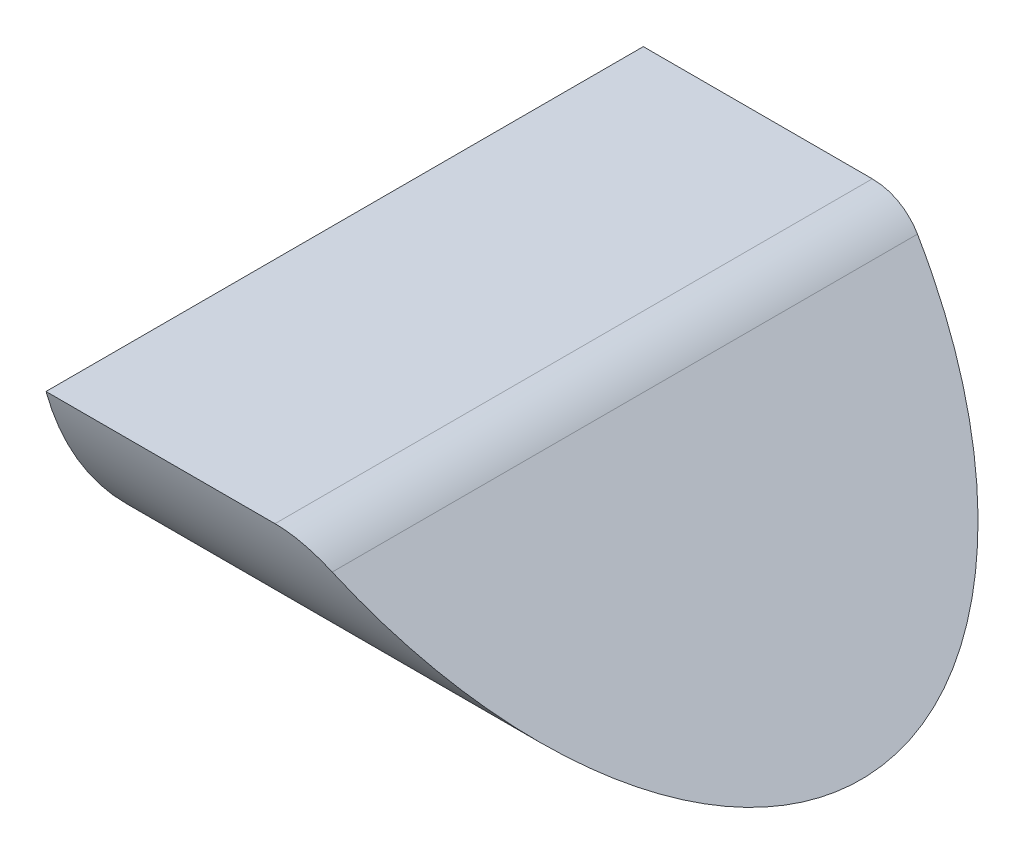
ISO-10303-21;
HEADER;
FILE_DESCRIPTION(('STEP AP214'),'2;1');
FILE_NAME('part.step','',(''),(''),'','','');
FILE_SCHEMA(('AUTOMOTIVE_DESIGN { 1 0 10303 214 1 1 1 1 }'));
ENDSEC;
DATA;
#1=APPLICATION_CONTEXT('core data for automotive mechanical design processes');
#2=APPLICATION_PROTOCOL_DEFINITION('international standard','automotive_design',2000,#1);
#3=PRODUCT_CONTEXT('',#1,'mechanical');
#4=PRODUCT('Part','Part','',(#3));
#5=PRODUCT_RELATED_PRODUCT_CATEGORY('part','',(#4));
#6=PRODUCT_DEFINITION_FORMATION('','',#4);
#7=PRODUCT_DEFINITION_CONTEXT('part definition',#1,'design');
#8=PRODUCT_DEFINITION('design','',#6,#7);
#9=PRODUCT_DEFINITION_SHAPE('','',#8);
#10=(LENGTH_UNIT() NAMED_UNIT(*) SI_UNIT(.MILLI.,.METRE.));
#11=(NAMED_UNIT(*) PLANE_ANGLE_UNIT() SI_UNIT($,.RADIAN.));
#12=(NAMED_UNIT(*) SI_UNIT($,.STERADIAN.) SOLID_ANGLE_UNIT());
#13=UNCERTAINTY_MEASURE_WITH_UNIT(LENGTH_MEASURE(1.E-05),#10,'distance_accuracy_value','');
#14=(GEOMETRIC_REPRESENTATION_CONTEXT(3) GLOBAL_UNCERTAINTY_ASSIGNED_CONTEXT((#13)) GLOBAL_UNIT_ASSIGNED_CONTEXT((#10,
#11,#12)) REPRESENTATION_CONTEXT('',''));
#15=CARTESIAN_POINT('',(0.,0.,0.));
#16=DIRECTION('',(0.,0.,1.));
#17=DIRECTION('',(1.,0.,0.));
#18=AXIS2_PLACEMENT_3D('',#15,#16,#17);
#19=CARTESIAN_POINT('',(0.,0.,0.));
#20=DIRECTION('',(1.,0.,0.));
#21=DIRECTION('',(0.,0.,-1.));
#22=AXIS2_PLACEMENT_3D('',#19,#20,#21);
#23=PLANE('',#22);
#24=CARTESIAN_POINT('',(0.,-45.72,0.));
#25=DIRECTION('',(-1.,0.,0.));
#26=DIRECTION('',(0.,0.,1.));
#27=AXIS2_PLACEMENT_3D('',#24,#25,#26);
#28=CIRCLE('',#27,6.477);
#29=CARTESIAN_POINT('',(0.,-45.72,6.477));
#30=VERTEX_POINT('',#29);
#31=EDGE_CURVE('E95',#30,#30,#28,.T.);
#32=ORIENTED_EDGE('',*,*,#31,.F.);
#33=EDGE_LOOP('',(#32));
#34=FACE_BOUND('',#33,.T.);
#35=DIRECTION('',(0.,0.,1.));
#36=VECTOR('',#35,1.);
#37=CARTESIAN_POINT('',(0.,-20.32,73.4407080575889));
#38=LINE('',#37,#36);
#39=CARTESIAN_POINT('',(0.,-20.32,-73.4407080575889));
#40=VERTEX_POINT('',#39);
#41=CARTESIAN_POINT('',(0.,-20.32,73.4407080575889));
#42=VERTEX_POINT('',#41);
#43=EDGE_CURVE('E49',#40,#42,#38,.T.);
#44=ORIENTED_EDGE('',*,*,#43,.F.);
#45=CARTESIAN_POINT('',(0.,0.,0.));
#46=DIRECTION('',(1.,0.,0.));
#47=DIRECTION('',(0.,0.,-1.));
#48=AXIS2_PLACEMENT_3D('',#45,#46,#47);
#49=CIRCLE('',#48,76.2);
#50=EDGE_CURVE('E11',#42,#40,#49,.T.);
#51=ORIENTED_EDGE('',*,*,#50,.F.);
#52=EDGE_LOOP('',(#44,#51));
#53=FACE_BOUND('',#52,.T.);
#54=ADVANCED_FACE('F42',(#34,#53),#23,.F.);
#55=CARTESIAN_POINT('',(127.,-76.2,-73.4407080575889));
#56=DIRECTION('',(0.660627894892025,0.750713516922755,0.));
#57=DIRECTION('',(-0.750713516922755,0.660627894892025,0.));
#58=AXIS2_PLACEMENT_3D('',#55,#56,#57);
#59=PLANE('',#58);
#60=CARTESIAN_POINT('',(40.4090909090909,0.,0.));
#61=DIRECTION('',(0.660627894892025,0.750713516922755,0.));
#62=DIRECTION('',(-0.750713516922755,0.660627894892025,0.));
#63=AXIS2_PLACEMENT_3D('',#60,#61,#62);
#64=ELLIPSE('',#63,115.344811487947,76.2);
#65=CARTESIAN_POINT('',(68.8964857984335,-25.0689075026215,71.9582509280555));
#66=VERTEX_POINT('',#65);
#67=CARTESIAN_POINT('',(68.8964857984335,-25.0689075026215,-71.9582509280555));
#68=VERTEX_POINT('',#67);
#69=EDGE_CURVE('E86',#66,#68,#64,.T.);
#70=ORIENTED_EDGE('',*,*,#69,.T.);
#71=DIRECTION('',(0.,0.,1.));
#72=VECTOR('',#71,1.);
#73=CARTESIAN_POINT('',(68.8964857984335,-25.0689075026215,73.4407080575889));
#74=LINE('',#73,#72);
#75=EDGE_CURVE('E77',#68,#66,#74,.T.);
#76=ORIENTED_EDGE('',*,*,#75,.T.);
#77=EDGE_LOOP('',(#70,#76));
#78=FACE_BOUND('',#77,.T.);
#79=ADVANCED_FACE('F85',(#78),#59,.T.);
#80=CARTESIAN_POINT('',(56.3115244007405,-39.37,-73.4407080575889));
#81=DIRECTION('',(0.,0.,-1.));
#82=DIRECTION('',(-1.,0.,0.));
#83=AXIS2_PLACEMENT_3D('',#80,#81,#82);
#84=CYLINDRICAL_SURFACE('',#83,19.05);
#85=CARTESIAN_POINT('',(56.3115244007405,-20.32,-73.4407080575889));
#86=CARTESIAN_POINT('',(56.5700300316652,-20.3199991554033,-73.4407063359609));
#87=CARTESIAN_POINT('',(56.8285068692522,-20.3252625194358,-73.4392522302459));
#88=CARTESIAN_POINT('',(57.3449933709856,-20.3462977918162,-73.4334279449559));
#89=CARTESIAN_POINT('',(57.6030030463425,-20.3620694445554,-73.4290578363111));
#90=CARTESIAN_POINT('',(58.3756196292876,-20.4251079297358,-73.4115590749349));
#91=CARTESIAN_POINT('',(58.8889310985459,-20.4880983076445,-73.3940419959211));
#92=CARTESIAN_POINT('',(59.9085459181511,-20.6555396830979,-73.3470942027149));
#93=CARTESIAN_POINT('',(60.4148443763769,-20.7600182495076,-73.3176555664));
#94=CARTESIAN_POINT('',(61.1659162184489,-20.9470794237377,-73.2643432188116));
#95=CARTESIAN_POINT('',(61.4148825050259,-21.0144920494826,-73.2450462183593));
#96=CARTESIAN_POINT('',(61.9096992011996,-21.1593050646107,-73.2033434518041));
#97=CARTESIAN_POINT('',(62.1555487973612,-21.2367080047689,-73.180936891643));
#98=CARTESIAN_POINT('',(62.8879148651462,-21.4837192599353,-73.1089553677631));
#99=CARTESIAN_POINT('',(63.3690781785711,-21.6680874998351,-73.0546305428251));
#100=CARTESIAN_POINT('',(64.3135040794081,-22.0744775645498,-72.9328620778276));
#101=CARTESIAN_POINT('',(64.776766727245,-22.2964992622499,-72.8654184820558));
#102=CARTESIAN_POINT('',(65.4553064640745,-22.655959058814,-72.7541282211962));
#103=CARTESIAN_POINT('',(65.6785787479972,-22.7800674413941,-72.7153810237203));
#104=CARTESIAN_POINT('',(66.1194358324064,-23.0368299196799,-72.6344449693006));
#105=CARTESIAN_POINT('',(66.3370219237689,-23.1694820516768,-72.5922569026222));
#106=CARTESIAN_POINT('',(66.9806094084258,-23.5797588645024,-72.4604543853985));
#107=CARTESIAN_POINT('',(67.3977311739668,-23.869858442782,-72.3655541843622));
#108=CARTESIAN_POINT('',(67.9900014033369,-24.317701229711,-72.2157325643111));
#109=CARTESIAN_POINT('',(68.1756868803434,-24.4636329764668,-72.1664429477341));
#110=CARTESIAN_POINT('',(68.5407785815588,-24.7616711283959,-72.0647237133339));
#111=CARTESIAN_POINT('',(68.7201917406196,-24.9137702849992,-72.012297749068));
#112=CARTESIAN_POINT('',(68.8964857984335,-25.0689075026215,-71.9582509280555));
#113=B_SPLINE_CURVE_WITH_KNOTS('',3,(#85,#86,#87,#88,#89,#90,#91,#92,#93,#94,#95,#96,#97,#98,
#99,#100,#101,#102,#103,#104,#105,#106,#107,#108,#109,#110,#111,#112),.UNSPECIFIED.,.F.,.F.,(4,
2,2,2,2,2,2,2,2,2,2,2,2,4),(0.,0.775401755467531,1.55078465037207,3.10120056928607,
4.65264846686549,5.42840398235091,6.20435796075182,7.75679239890763,9.30922159628545,
10.0841266728021,10.8588542751337,12.4073134809147,13.1309404636671,13.8537403093022),.UNSPECIFIED.);
#114=CARTESIAN_POINT('',(56.3115244007405,-20.32,-73.4407080575889));
#115=VERTEX_POINT('',#114);
#116=EDGE_CURVE('E81',#115,#68,#113,.T.);
#117=ORIENTED_EDGE('',*,*,#116,.F.);
#118=DIRECTION('',(0.,0.,1.));
#119=VECTOR('',#118,1.);
#120=CARTESIAN_POINT('',(56.3115244007405,-20.32,-73.4407080575889));
#121=LINE('',#120,#119);
#122=CARTESIAN_POINT('',(56.3115244007405,-20.32,73.4407080575889));
#123=VERTEX_POINT('',#122);
#124=EDGE_CURVE('E78',#123,#115,#121,.F.);
#125=ORIENTED_EDGE('',*,*,#124,.F.);
#126=CARTESIAN_POINT('',(68.8964857984335,-25.0689075026215,71.9582509280555));
#127=CARTESIAN_POINT('',(68.7064542501679,-24.9016785081498,72.0165103712882));
#128=CARTESIAN_POINT('',(68.5127854519955,-24.7379734106293,72.0728884396596));
#129=CARTESIAN_POINT('',(68.118430385301,-24.417944457579,72.1819407291992));
#130=CARTESIAN_POINT('',(67.9177440441064,-24.2616206785282,72.2346149119936));
#131=CARTESIAN_POINT('',(67.305615092634,-23.8042750176876,72.3871520859349));
#132=CARTESIAN_POINT('',(66.8840420341254,-23.5148254865147,72.4815481690505));
#133=CARTESIAN_POINT('',(66.0162823982986,-22.969289875495,72.6562726062024));
#134=CARTESIAN_POINT('',(65.5700619251986,-22.7132514556661,72.7365809194179));
#135=CARTESIAN_POINT('',(64.6565907722593,-22.2373547959698,72.8834829377334));
#136=CARTESIAN_POINT('',(64.1893418060932,-22.0174936146887,72.9500777579287));
#137=CARTESIAN_POINT('',(63.2366164349324,-21.6157567148279,73.0701244943568));
#138=CARTESIAN_POINT('',(62.751122593231,-21.4339184832271,73.1235634492858));
#139=CARTESIAN_POINT('',(61.7657137088763,-21.1101173924322,73.2176987135927));
#140=CARTESIAN_POINT('',(61.2657962544859,-20.9681612449332,73.2583928783014));
#141=CARTESIAN_POINT('',(60.2564618946426,-20.7257313441812,73.3273476315661));
#142=CARTESIAN_POINT('',(59.7470707423129,-20.6251585940407,73.3556379033363));
#143=CARTESIAN_POINT('',(58.7214840405937,-20.4659362421299,73.4002203277552));
#144=CARTESIAN_POINT('',(58.2052925881303,-20.4072624774118,73.4165193958391));
#145=CARTESIAN_POINT('',(57.4585424680954,-20.3531744547465,73.4315226030949));
#146=CARTESIAN_POINT('',(57.2291968767097,-20.3407293276696,73.4349700272801));
#147=CARTESIAN_POINT('',(56.7704180495646,-20.3241466960878,73.4395609779635));
#148=CARTESIAN_POINT('',(56.5409851449127,-20.3200006846576,73.4407068636348));
#149=CARTESIAN_POINT('',(56.3115244007405,-20.32,73.4407080575889));
#150=B_SPLINE_CURVE_WITH_KNOTS('',3,(#126,#127,#128,#129,#130,#131,#132,#133,#134,#135,#136,
#137,#138,#139,#140,#141,#142,#143,#144,#145,#146,#147,#148,#149),.UNSPECIFIED.,.F.,.F.,(4,2,2,
2,2,2,2,2,2,2,2,4),(0.,0.779143026024567,1.55829412311673,3.116348855589,4.67660236416525,
6.2367289525701,7.79838649844045,9.36030669607524,10.9184684540224,12.475730900133,
13.1647238035012,13.853010099203),.UNSPECIFIED.);
#151=EDGE_CURVE('E73',#66,#123,#150,.T.);
#152=ORIENTED_EDGE('',*,*,#151,.F.);
#153=ORIENTED_EDGE('',*,*,#75,.F.);
#154=EDGE_LOOP('',(#117,#125,#152,#153));
#155=FACE_BOUND('',#154,.T.);
#156=ADVANCED_FACE('F76',(#155),#84,.T.);
#157=CARTESIAN_POINT('',(127.,0.,0.));
#158=DIRECTION('',(-1.,0.,0.));
#159=DIRECTION('',(0.,0.,1.));
#160=AXIS2_PLACEMENT_3D('',#157,#158,#159);
#161=CYLINDRICAL_SURFACE('',#160,76.2);
#162=DIRECTION('',(-1.,0.,0.));
#163=VECTOR('',#162,1.);
#164=CARTESIAN_POINT('',(127.,-20.32,73.4407080575889));
#165=LINE('',#164,#163);
#166=EDGE_CURVE('E90',#123,#42,#165,.T.);
#167=ORIENTED_EDGE('',*,*,#166,.T.);
#168=ORIENTED_EDGE('',*,*,#50,.T.);
#169=DIRECTION('',(-1.,0.,0.));
#170=VECTOR('',#169,1.);
#171=CARTESIAN_POINT('',(127.,-20.32,-73.4407080575889));
#172=LINE('',#171,#170);
#173=EDGE_CURVE('E87',#115,#40,#172,.T.);
#174=ORIENTED_EDGE('',*,*,#173,.F.);
#175=ORIENTED_EDGE('',*,*,#116,.T.);
#176=ORIENTED_EDGE('',*,*,#69,.F.);
#177=ORIENTED_EDGE('',*,*,#151,.T.);
#178=EDGE_LOOP('',(#167,#168,#174,#175,#176,#177));
#179=FACE_BOUND('',#178,.T.);
#180=ADVANCED_FACE('F89',(#179),#161,.T.);
#181=CARTESIAN_POINT('',(127.,-20.32,73.4407080575889));
#182=DIRECTION('',(0.,-1.,0.));
#183=DIRECTION('',(0.,0.,-1.));
#184=AXIS2_PLACEMENT_3D('',#181,#182,#183);
#185=PLANE('',#184);
#186=ORIENTED_EDGE('',*,*,#173,.T.);
#187=ORIENTED_EDGE('',*,*,#43,.T.);
#188=ORIENTED_EDGE('',*,*,#166,.F.);
#189=ORIENTED_EDGE('',*,*,#124,.T.);
#190=EDGE_LOOP('',(#186,#187,#188,#189));
#191=FACE_BOUND('',#190,.T.);
#192=ADVANCED_FACE('F115',(#191),#185,.F.);
#193=CARTESIAN_POINT('',(7.62,-45.72,0.));
#194=DIRECTION('',(-1.,0.,0.));
#195=DIRECTION('',(0.,0.,1.));
#196=AXIS2_PLACEMENT_3D('',#193,#194,#195);
#197=CYLINDRICAL_SURFACE('',#196,6.477);
#198=CARTESIAN_POINT('',(7.62,-45.72,0.));
#199=DIRECTION('',(-1.,0.,0.));
#200=DIRECTION('',(0.,0.,1.));
#201=AXIS2_PLACEMENT_3D('',#198,#199,#200);
#202=CIRCLE('',#201,6.477);
#203=CARTESIAN_POINT('',(7.62,-45.72,6.477));
#204=VERTEX_POINT('',#203);
#205=EDGE_CURVE('E91',#204,#204,#202,.T.);
#206=CARTESIAN_POINT('',(7.62,-45.72,6.477));
#207=CARTESIAN_POINT('',(7.540625,-45.72,6.477));
#208=CARTESIAN_POINT('',(7.46125,-45.72,6.477));
#209=CARTESIAN_POINT('',(7.3025,-45.72,6.477));
#210=CARTESIAN_POINT('',(7.223125,-45.72,6.477));
#211=CARTESIAN_POINT('',(7.064375,-45.72,6.477));
#212=CARTESIAN_POINT('',(6.985,-45.72,6.477));
#213=CARTESIAN_POINT('',(6.82625,-45.72,6.477));
#214=CARTESIAN_POINT('',(6.746875,-45.72,6.477));
#215=CARTESIAN_POINT('',(6.588125,-45.72,6.477));
#216=CARTESIAN_POINT('',(6.50875,-45.72,6.477));
#217=CARTESIAN_POINT('',(6.35,-45.72,6.477));
#218=CARTESIAN_POINT('',(6.270625,-45.72,6.477));
#219=CARTESIAN_POINT('',(6.111875,-45.72,6.477));
#220=CARTESIAN_POINT('',(6.0325,-45.72,6.477));
#221=CARTESIAN_POINT('',(5.87375,-45.72,6.477));
#222=CARTESIAN_POINT('',(5.794375,-45.72,6.477));
#223=CARTESIAN_POINT('',(5.635625,-45.72,6.477));
#224=CARTESIAN_POINT('',(5.55625,-45.72,6.477));
#225=CARTESIAN_POINT('',(5.3975,-45.72,6.477));
#226=CARTESIAN_POINT('',(5.318125,-45.72,6.477));
#227=CARTESIAN_POINT('',(5.159375,-45.72,6.477));
#228=CARTESIAN_POINT('',(5.08,-45.72,6.477));
#229=CARTESIAN_POINT('',(4.92125,-45.72,6.477));
#230=CARTESIAN_POINT('',(4.841875,-45.72,6.477));
#231=CARTESIAN_POINT('',(4.683125,-45.72,6.477));
#232=CARTESIAN_POINT('',(4.60375,-45.72,6.477));
#233=CARTESIAN_POINT('',(4.445,-45.72,6.477));
#234=CARTESIAN_POINT('',(4.365625,-45.72,6.477));
#235=CARTESIAN_POINT('',(4.206875,-45.72,6.477));
#236=CARTESIAN_POINT('',(4.1275,-45.72,6.477));
#237=CARTESIAN_POINT('',(3.96875,-45.72,6.477));
#238=CARTESIAN_POINT('',(3.889375,-45.72,6.477));
#239=CARTESIAN_POINT('',(3.730625,-45.72,6.477));
#240=CARTESIAN_POINT('',(3.65125,-45.72,6.477));
#241=CARTESIAN_POINT('',(3.4925,-45.72,6.477));
#242=CARTESIAN_POINT('',(3.413125,-45.72,6.477));
#243=CARTESIAN_POINT('',(3.254375,-45.72,6.477));
#244=CARTESIAN_POINT('',(3.175,-45.72,6.477));
#245=CARTESIAN_POINT('',(3.01625,-45.72,6.477));
#246=CARTESIAN_POINT('',(2.936875,-45.72,6.477));
#247=CARTESIAN_POINT('',(2.778125,-45.72,6.477));
#248=CARTESIAN_POINT('',(2.69875,-45.72,6.477));
#249=CARTESIAN_POINT('',(2.54,-45.72,6.477));
#250=CARTESIAN_POINT('',(2.460625,-45.72,6.477));
#251=CARTESIAN_POINT('',(2.301875,-45.72,6.477));
#252=CARTESIAN_POINT('',(2.2225,-45.72,6.477));
#253=CARTESIAN_POINT('',(2.06375,-45.72,6.477));
#254=CARTESIAN_POINT('',(1.984375,-45.72,6.477));
#255=CARTESIAN_POINT('',(1.825625,-45.72,6.477));
#256=CARTESIAN_POINT('',(1.74625,-45.72,6.477));
#257=CARTESIAN_POINT('',(1.5875,-45.72,6.477));
#258=CARTESIAN_POINT('',(1.508125,-45.72,6.477));
#259=CARTESIAN_POINT('',(1.349375,-45.72,6.477));
#260=CARTESIAN_POINT('',(1.27,-45.72,6.477));
#261=CARTESIAN_POINT('',(1.11125,-45.72,6.477));
#262=CARTESIAN_POINT('',(1.031875,-45.72,6.477));
#263=CARTESIAN_POINT('',(0.873125,-45.72,6.477));
#264=CARTESIAN_POINT('',(0.79375,-45.72,6.477));
#265=CARTESIAN_POINT('',(0.635,-45.72,6.477));
#266=CARTESIAN_POINT('',(0.555625,-45.72,6.477));
#267=CARTESIAN_POINT('',(0.396875,-45.72,6.477));
#268=CARTESIAN_POINT('',(0.3175,-45.72,6.477));
#269=CARTESIAN_POINT('',(0.15875,-45.72,6.477));
#270=CARTESIAN_POINT('',(0.0793749999999999,-45.72,6.477));
#271=CARTESIAN_POINT('',(0.,-45.72,6.477));
#272=B_SPLINE_CURVE_WITH_KNOTS('',3,(#206,#207,#208,#209,#210,#211,#212,#213,#214,#215,#216,
#217,#218,#219,#220,#221,#222,#223,#224,#225,#226,#227,#228,#229,#230,#231,#232,#233,#234,#235,
#236,#237,#238,#239,#240,#241,#242,#243,#244,#245,#246,#247,#248,#249,#250,#251,#252,#253,#254,
#255,#256,#257,#258,#259,#260,#261,#262,#263,#264,#265,#266,#267,#268,#269,#270,#271),
.UNSPECIFIED.,.F.,.F.,(4,2,2,2,2,2,2,2,2,2,2,2,2,2,2,2,2,2,2,2,2,2,2,2,2,2,2,2,2,2,2,2,4),(0.,
0.238125,0.476249999999999,0.714375,0.952499999999999,1.190625,1.42875,1.666875,1.905,2.143125,
2.38125,2.619375,2.8575,3.095625,3.33375,3.571875,3.81,4.048125,4.28625,4.524375,4.7625,
5.000625,5.23875,5.476875,5.715,5.953125,6.19125,6.429375,6.6675,6.905625,7.14375,7.381875,
7.62),.UNSPECIFIED.);
#273=EDGE_CURVE('BSEAM119',#204,#30,#272,.T.);
#274=ORIENTED_EDGE('',*,*,#205,.F.);
#275=ORIENTED_EDGE('',*,*,#31,.T.);
#276=ORIENTED_EDGE('',*,*,#273,.T.);
#277=ORIENTED_EDGE('',*,*,#273,.F.);
#278=EDGE_LOOP('',(#274,#276,#275,#277));
#279=FACE_BOUND('',#278,.T.);
#280=ADVANCED_FACE('F119',(#279),#197,.F.);
#281=CARTESIAN_POINT('',(7.62,-45.72,0.));
#282=DIRECTION('',(-1.,0.,0.));
#283=DIRECTION('',(0.,0.,1.));
#284=AXIS2_PLACEMENT_3D('',#281,#282,#283);
#285=PLANE('',#284);
#286=ORIENTED_EDGE('',*,*,#205,.T.);
#287=EDGE_LOOP('',(#286));
#288=FACE_BOUND('',#287,.T.);
#289=ADVANCED_FACE('F125',(#288),#285,.T.);
#290=CLOSED_SHELL('',(#54,#79,#156,#180,#192,#280,#289));
#291=MANIFOLD_SOLID_BREP('B2',#290);
#292=ADVANCED_BREP_SHAPE_REPRESENTATION('',(#18,#291),#14);
#293=SHAPE_DEFINITION_REPRESENTATION(#9,#292);
ENDSEC;
END-ISO-10303-21;
